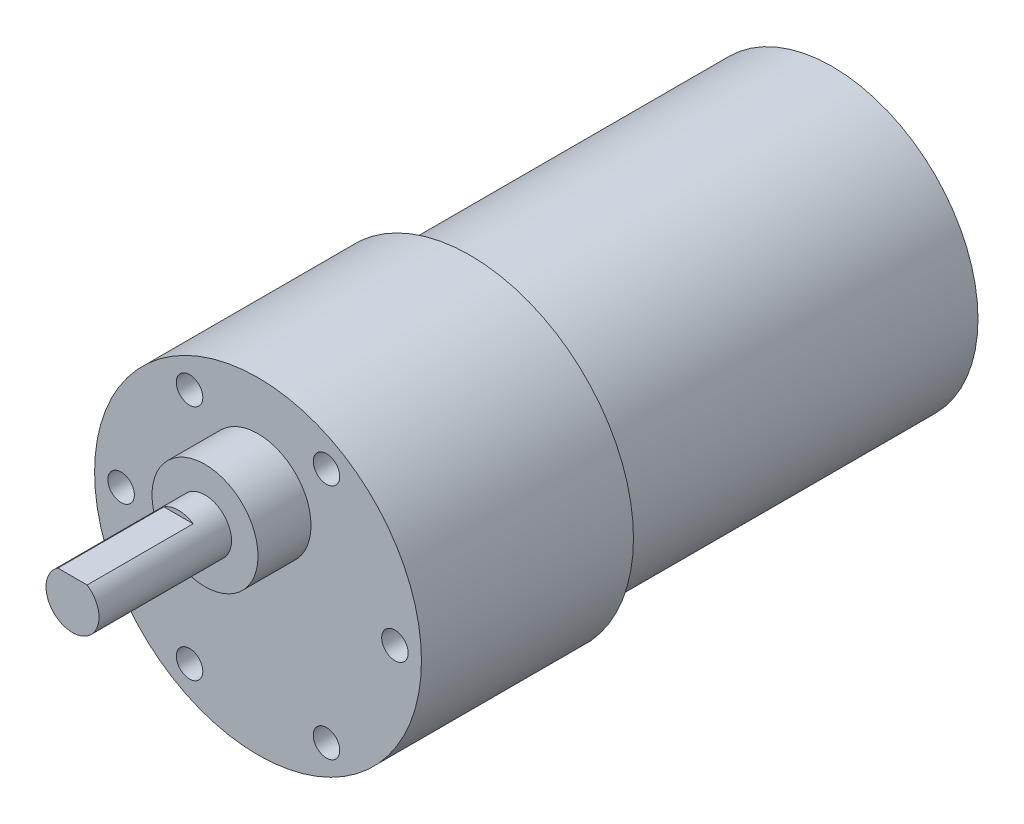
ISO-10303-21;
HEADER;
FILE_DESCRIPTION(('STEP AP214'),'2;1');
FILE_NAME('part.step','',(''),(''),'','','');
FILE_SCHEMA(('AUTOMOTIVE_DESIGN { 1 0 10303 214 1 1 1 1 }'));
ENDSEC;
DATA;
#1=APPLICATION_CONTEXT('core data for automotive mechanical design processes');
#2=APPLICATION_PROTOCOL_DEFINITION('international standard','automotive_design',2000,#1);
#3=PRODUCT_CONTEXT('',#1,'mechanical');
#4=PRODUCT('Part','Part','',(#3));
#5=PRODUCT_RELATED_PRODUCT_CATEGORY('part','',(#4));
#6=PRODUCT_DEFINITION_FORMATION('','',#4);
#7=PRODUCT_DEFINITION_CONTEXT('part definition',#1,'design');
#8=PRODUCT_DEFINITION('design','',#6,#7);
#9=PRODUCT_DEFINITION_SHAPE('','',#8);
#10=(LENGTH_UNIT() NAMED_UNIT(*) SI_UNIT(.MILLI.,.METRE.));
#11=(NAMED_UNIT(*) PLANE_ANGLE_UNIT() SI_UNIT($,.RADIAN.));
#12=(NAMED_UNIT(*) SI_UNIT($,.STERADIAN.) SOLID_ANGLE_UNIT());
#13=UNCERTAINTY_MEASURE_WITH_UNIT(LENGTH_MEASURE(1.E-05),#10,'distance_accuracy_value','');
#14=(GEOMETRIC_REPRESENTATION_CONTEXT(3) GLOBAL_UNCERTAINTY_ASSIGNED_CONTEXT((#13)) GLOBAL_UNIT_ASSIGNED_CONTEXT((#10,
#11,#12)) REPRESENTATION_CONTEXT('',''));
#15=CARTESIAN_POINT('',(0.,0.,0.));
#16=DIRECTION('',(0.,0.,1.));
#17=DIRECTION('',(1.,0.,0.));
#18=AXIS2_PLACEMENT_3D('',#15,#16,#17);
#19=CARTESIAN_POINT('',(0.,0.,29.));
#20=DIRECTION('',(0.,0.,-1.));
#21=DIRECTION('',(-1.,0.,0.));
#22=AXIS2_PLACEMENT_3D('',#19,#20,#21);
#23=CYLINDRICAL_SURFACE('',#22,16.5);
#24=CARTESIAN_POINT('',(0.,0.,29.));
#25=DIRECTION('',(0.,0.,1.));
#26=DIRECTION('',(1.,0.,0.));
#27=AXIS2_PLACEMENT_3D('',#24,#25,#26);
#28=CIRCLE('',#27,16.5);
#29=CARTESIAN_POINT('',(-16.5,0.,29.));
#30=VERTEX_POINT('',#29);
#31=EDGE_CURVE('E42',#30,#30,#28,.T.);
#32=CARTESIAN_POINT('',(0.,0.,-12.));
#33=DIRECTION('',(0.,0.,-1.));
#34=DIRECTION('',(-1.,0.,0.));
#35=AXIS2_PLACEMENT_3D('',#32,#33,#34);
#36=CIRCLE('',#35,16.5);
#37=CARTESIAN_POINT('',(-16.5,0.,-12.));
#38=VERTEX_POINT('',#37);
#39=EDGE_CURVE('E79',#38,#38,#36,.T.);
#40=CARTESIAN_POINT('',(-16.5,0.,29.));
#41=CARTESIAN_POINT('',(-16.5,0.,28.5729166666667));
#42=CARTESIAN_POINT('',(-16.5,0.,28.1458333333333));
#43=CARTESIAN_POINT('',(-16.5,0.,27.2916666666667));
#44=CARTESIAN_POINT('',(-16.5,0.,26.8645833333333));
#45=CARTESIAN_POINT('',(-16.5,0.,26.0104166666667));
#46=CARTESIAN_POINT('',(-16.5,0.,25.5833333333333));
#47=CARTESIAN_POINT('',(-16.5,0.,24.7291666666667));
#48=CARTESIAN_POINT('',(-16.5,0.,24.3020833333333));
#49=CARTESIAN_POINT('',(-16.5,0.,23.4479166666667));
#50=CARTESIAN_POINT('',(-16.5,0.,23.0208333333333));
#51=CARTESIAN_POINT('',(-16.5,0.,22.1666666666667));
#52=CARTESIAN_POINT('',(-16.5,0.,21.7395833333333));
#53=CARTESIAN_POINT('',(-16.5,0.,20.8854166666667));
#54=CARTESIAN_POINT('',(-16.5,0.,20.4583333333333));
#55=CARTESIAN_POINT('',(-16.5,0.,19.6041666666667));
#56=CARTESIAN_POINT('',(-16.5,0.,19.1770833333333));
#57=CARTESIAN_POINT('',(-16.5,0.,18.3229166666667));
#58=CARTESIAN_POINT('',(-16.5,0.,17.8958333333333));
#59=CARTESIAN_POINT('',(-16.5,0.,17.0416666666667));
#60=CARTESIAN_POINT('',(-16.5,0.,16.6145833333333));
#61=CARTESIAN_POINT('',(-16.5,0.,15.7604166666667));
#62=CARTESIAN_POINT('',(-16.5,0.,15.3333333333333));
#63=CARTESIAN_POINT('',(-16.5,0.,14.4791666666667));
#64=CARTESIAN_POINT('',(-16.5,0.,14.0520833333333));
#65=CARTESIAN_POINT('',(-16.5,0.,13.1979166666667));
#66=CARTESIAN_POINT('',(-16.5,0.,12.7708333333333));
#67=CARTESIAN_POINT('',(-16.5,0.,11.9166666666667));
#68=CARTESIAN_POINT('',(-16.5,0.,11.4895833333333));
#69=CARTESIAN_POINT('',(-16.5,0.,10.6354166666667));
#70=CARTESIAN_POINT('',(-16.5,0.,10.2083333333333));
#71=CARTESIAN_POINT('',(-16.5,0.,9.35416666666666));
#72=CARTESIAN_POINT('',(-16.5,0.,8.92708333333333));
#73=CARTESIAN_POINT('',(-16.5,0.,8.07291666666666));
#74=CARTESIAN_POINT('',(-16.5,0.,7.64583333333333));
#75=CARTESIAN_POINT('',(-16.5,0.,6.79166666666666));
#76=CARTESIAN_POINT('',(-16.5,0.,6.36458333333333));
#77=CARTESIAN_POINT('',(-16.5,0.,5.51041666666666));
#78=CARTESIAN_POINT('',(-16.5,0.,5.08333333333333));
#79=CARTESIAN_POINT('',(-16.5,0.,4.22916666666666));
#80=CARTESIAN_POINT('',(-16.5,0.,3.80208333333333));
#81=CARTESIAN_POINT('',(-16.5,0.,2.94791666666666));
#82=CARTESIAN_POINT('',(-16.5,0.,2.52083333333333));
#83=CARTESIAN_POINT('',(-16.5,0.,1.66666666666666));
#84=CARTESIAN_POINT('',(-16.5,0.,1.23958333333333));
#85=CARTESIAN_POINT('',(-16.5,0.,0.385416666666664));
#86=CARTESIAN_POINT('',(-16.5,0.,-0.0416666666666702));
#87=CARTESIAN_POINT('',(-16.5,0.,-0.895833333333338));
#88=CARTESIAN_POINT('',(-16.5,0.,-1.32291666666667));
#89=CARTESIAN_POINT('',(-16.5,0.,-2.17708333333334));
#90=CARTESIAN_POINT('',(-16.5,0.,-2.60416666666667));
#91=CARTESIAN_POINT('',(-16.5,0.,-3.45833333333333));
#92=CARTESIAN_POINT('',(-16.5,0.,-3.88541666666667));
#93=CARTESIAN_POINT('',(-16.5,0.,-4.73958333333333));
#94=CARTESIAN_POINT('',(-16.5,0.,-5.16666666666667));
#95=CARTESIAN_POINT('',(-16.5,0.,-6.02083333333333));
#96=CARTESIAN_POINT('',(-16.5,0.,-6.44791666666666));
#97=CARTESIAN_POINT('',(-16.5,0.,-7.30208333333333));
#98=CARTESIAN_POINT('',(-16.5,0.,-7.72916666666667));
#99=CARTESIAN_POINT('',(-16.5,0.,-8.58333333333333));
#100=CARTESIAN_POINT('',(-16.5,0.,-9.01041666666666));
#101=CARTESIAN_POINT('',(-16.5,0.,-9.86458333333333));
#102=CARTESIAN_POINT('',(-16.5,0.,-10.2916666666667));
#103=CARTESIAN_POINT('',(-16.5,0.,-11.1458333333333));
#104=CARTESIAN_POINT('',(-16.5,0.,-11.5729166666667));
#105=CARTESIAN_POINT('',(-16.5,0.,-12.));
#106=B_SPLINE_CURVE_WITH_KNOTS('',3,(#40,#41,#42,#43,#44,#45,#46,#47,#48,#49,#50,#51,#52,#53,
#54,#55,#56,#57,#58,#59,#60,#61,#62,#63,#64,#65,#66,#67,#68,#69,#70,#71,#72,#73,#74,#75,#76,#77,
#78,#79,#80,#81,#82,#83,#84,#85,#86,#87,#88,#89,#90,#91,#92,#93,#94,#95,#96,#97,#98,#99,#100,
#101,#102,#103,#104,#105),.UNSPECIFIED.,.F.,.F.,(4,2,2,2,2,2,2,2,2,2,2,2,2,2,2,2,2,2,2,2,2,2,2,
2,2,2,2,2,2,2,2,2,4),(0.,1.28125,2.5625,3.84375,5.125,6.40625,7.6875,8.96875,10.25,11.53125,
12.8125,14.09375,15.375,16.65625,17.9375,19.21875,20.5,21.78125,23.0625,24.34375,25.625,
26.90625,28.1875,29.46875,30.75,32.03125,33.3125,34.59375,35.875,37.15625,38.4375,39.71875,41.),.UNSPECIFIED.);
#107=EDGE_CURVE('BSEAM39',#30,#38,#106,.T.);
#108=ORIENTED_EDGE('',*,*,#31,.F.);
#109=ORIENTED_EDGE('',*,*,#39,.F.);
#110=ORIENTED_EDGE('',*,*,#107,.T.);
#111=ORIENTED_EDGE('',*,*,#107,.F.);
#112=EDGE_LOOP('',(#108,#110,#109,#111));
#113=FACE_BOUND('',#112,.T.);
#114=ADVANCED_FACE('F39',(#113),#23,.T.);
#115=CARTESIAN_POINT('',(0.,0.,53.));
#116=DIRECTION('',(0.,0.,-1.));
#117=DIRECTION('',(-1.,0.,0.));
#118=AXIS2_PLACEMENT_3D('',#115,#116,#117);
#119=CYLINDRICAL_SURFACE('',#118,18.5);
#120=CARTESIAN_POINT('',(0.,0.,53.));
#121=DIRECTION('',(0.,0.,1.));
#122=DIRECTION('',(1.,0.,0.));
#123=AXIS2_PLACEMENT_3D('',#120,#121,#122);
#124=CIRCLE('',#123,18.5);
#125=CARTESIAN_POINT('',(18.5,0.,53.));
#126=VERTEX_POINT('',#125);
#127=EDGE_CURVE('E93',#126,#126,#124,.T.);
#128=ORIENTED_EDGE('',*,*,#127,.F.);
#129=EDGE_LOOP('',(#128));
#130=FACE_BOUND('',#129,.T.);
#131=CARTESIAN_POINT('',(0.,0.,29.));
#132=DIRECTION('',(0.,0.,1.));
#133=DIRECTION('',(1.,0.,0.));
#134=AXIS2_PLACEMENT_3D('',#131,#132,#133);
#135=CIRCLE('',#134,18.5);
#136=CARTESIAN_POINT('',(18.5,0.,29.));
#137=VERTEX_POINT('',#136);
#138=EDGE_CURVE('E90',#137,#137,#135,.T.);
#139=ORIENTED_EDGE('',*,*,#138,.T.);
#140=EDGE_LOOP('',(#139));
#141=FACE_BOUND('',#140,.T.);
#142=ADVANCED_FACE('F98',(#130,#141),#119,.T.);
#143=CARTESIAN_POINT('',(0.,0.,53.));
#144=DIRECTION('',(0.,0.,1.));
#145=DIRECTION('',(1.,0.,0.));
#146=AXIS2_PLACEMENT_3D('',#143,#144,#145);
#147=PLANE('',#146);
#148=CARTESIAN_POINT('',(-15.5,0.,53.));
#149=DIRECTION('',(0.,0.,1.));
#150=DIRECTION('',(1.,0.,0.));
#151=AXIS2_PLACEMENT_3D('',#148,#149,#150);
#152=CIRCLE('',#151,1.5);
#153=CARTESIAN_POINT('',(-14.,0.,53.));
#154=VERTEX_POINT('',#153);
#155=EDGE_CURVE('E131',#154,#154,#152,.T.);
#156=ORIENTED_EDGE('',*,*,#155,.F.);
#157=EDGE_LOOP('',(#156));
#158=FACE_BOUND('',#157,.T.);
#159=CARTESIAN_POINT('',(-7.74999999999987,13.4233937586589,53.));
#160=DIRECTION('',(0.,0.,1.));
#161=DIRECTION('',(1.,0.,0.));
#162=AXIS2_PLACEMENT_3D('',#159,#160,#161);
#163=CIRCLE('',#162,1.5);
#164=CARTESIAN_POINT('',(-6.24999999999987,13.4233937586589,53.));
#165=VERTEX_POINT('',#164);
#166=EDGE_CURVE('E409',#165,#165,#163,.T.);
#167=ORIENTED_EDGE('',*,*,#166,.F.);
#168=EDGE_LOOP('',(#167));
#169=FACE_BOUND('',#168,.T.);
#170=CARTESIAN_POINT('',(-7.75000000000006,-13.4233937586588,53.));
#171=DIRECTION('',(0.,0.,1.));
#172=DIRECTION('',(1.,0.,0.));
#173=AXIS2_PLACEMENT_3D('',#170,#171,#172);
#174=CIRCLE('',#173,1.5);
#175=CARTESIAN_POINT('',(-6.25000000000006,-13.4233937586588,53.));
#176=VERTEX_POINT('',#175);
#177=EDGE_CURVE('E428',#176,#176,#174,.T.);
#178=ORIENTED_EDGE('',*,*,#177,.F.);
#179=EDGE_LOOP('',(#178));
#180=FACE_BOUND('',#179,.T.);
#181=CARTESIAN_POINT('',(7.74999999999987,-13.4233937586589,53.));
#182=DIRECTION('',(0.,0.,1.));
#183=DIRECTION('',(1.,0.,0.));
#184=AXIS2_PLACEMENT_3D('',#181,#182,#183);
#185=CIRCLE('',#184,1.5);
#186=CARTESIAN_POINT('',(9.24999999999988,-13.4233937586589,53.));
#187=VERTEX_POINT('',#186);
#188=EDGE_CURVE('E423',#187,#187,#185,.T.);
#189=ORIENTED_EDGE('',*,*,#188,.F.);
#190=EDGE_LOOP('',(#189));
#191=FACE_BOUND('',#190,.T.);
#192=CARTESIAN_POINT('',(7.75000000000006,13.4233937586588,53.));
#193=DIRECTION('',(0.,0.,1.));
#194=DIRECTION('',(1.,0.,0.));
#195=AXIS2_PLACEMENT_3D('',#192,#193,#194);
#196=CIRCLE('',#195,1.5);
#197=CARTESIAN_POINT('',(9.25000000000006,13.4233937586588,53.));
#198=VERTEX_POINT('',#197);
#199=EDGE_CURVE('E417',#198,#198,#196,.T.);
#200=ORIENTED_EDGE('',*,*,#199,.F.);
#201=EDGE_LOOP('',(#200));
#202=FACE_BOUND('',#201,.T.);
#203=CARTESIAN_POINT('',(15.5,0.,53.));
#204=DIRECTION('',(0.,0.,1.));
#205=DIRECTION('',(1.,0.,0.));
#206=AXIS2_PLACEMENT_3D('',#203,#204,#205);
#207=CIRCLE('',#206,1.5);
#208=CARTESIAN_POINT('',(17.,0.,53.));
#209=VERTEX_POINT('',#208);
#210=EDGE_CURVE('E403',#209,#209,#207,.T.);
#211=ORIENTED_EDGE('',*,*,#210,.F.);
#212=EDGE_LOOP('',(#211));
#213=FACE_BOUND('',#212,.T.);
#214=CARTESIAN_POINT('',(0.,7.,53.));
#215=DIRECTION('',(0.,0.,1.));
#216=DIRECTION('',(1.,0.,0.));
#217=AXIS2_PLACEMENT_3D('',#214,#215,#216);
#218=CIRCLE('',#217,6.);
#219=CARTESIAN_POINT('',(6.,7.,53.));
#220=VERTEX_POINT('',#219);
#221=EDGE_CURVE('E71',#220,#220,#218,.T.);
#222=ORIENTED_EDGE('',*,*,#221,.F.);
#223=EDGE_LOOP('',(#222));
#224=FACE_BOUND('',#223,.T.);
#225=ORIENTED_EDGE('',*,*,#127,.T.);
#226=EDGE_LOOP('',(#225));
#227=FACE_BOUND('',#226,.T.);
#228=ADVANCED_FACE('F103',(#158,#169,#180,#191,#202,#213,#224,#227),#147,.T.);
#229=CARTESIAN_POINT('',(0.,0.,29.));
#230=DIRECTION('',(0.,0.,1.));
#231=DIRECTION('',(1.,0.,0.));
#232=AXIS2_PLACEMENT_3D('',#229,#230,#231);
#233=PLANE('',#232);
#234=ORIENTED_EDGE('',*,*,#31,.T.);
#235=EDGE_LOOP('',(#234));
#236=FACE_BOUND('',#235,.T.);
#237=ORIENTED_EDGE('',*,*,#138,.F.);
#238=EDGE_LOOP('',(#237));
#239=FACE_BOUND('',#238,.T.);
#240=ADVANCED_FACE('F100',(#236,#239),#233,.F.);
#241=CARTESIAN_POINT('',(0.,7.,59.));
#242=DIRECTION('',(0.,0.,-1.));
#243=DIRECTION('',(-1.,0.,0.));
#244=AXIS2_PLACEMENT_3D('',#241,#242,#243);
#245=CYLINDRICAL_SURFACE('',#244,6.);
#246=CARTESIAN_POINT('',(0.,7.,59.));
#247=DIRECTION('',(0.,0.,1.));
#248=DIRECTION('',(1.,0.,0.));
#249=AXIS2_PLACEMENT_3D('',#246,#247,#248);
#250=CIRCLE('',#249,6.);
#251=CARTESIAN_POINT('',(6.,7.,59.));
#252=VERTEX_POINT('',#251);
#253=EDGE_CURVE('E87',#252,#252,#250,.T.);
#254=ORIENTED_EDGE('',*,*,#253,.F.);
#255=EDGE_LOOP('',(#254));
#256=FACE_BOUND('',#255,.T.);
#257=ORIENTED_EDGE('',*,*,#221,.T.);
#258=EDGE_LOOP('',(#257));
#259=FACE_BOUND('',#258,.T.);
#260=ADVANCED_FACE('F102',(#256,#259),#245,.T.);
#261=CARTESIAN_POINT('',(0.,7.,59.));
#262=DIRECTION('',(0.,0.,1.));
#263=DIRECTION('',(1.,0.,0.));
#264=AXIS2_PLACEMENT_3D('',#261,#262,#263);
#265=PLANE('',#264);
#266=CARTESIAN_POINT('',(0.,7.,59.));
#267=DIRECTION('',(0.,0.,1.));
#268=DIRECTION('',(1.,0.,0.));
#269=AXIS2_PLACEMENT_3D('',#266,#267,#268);
#270=CIRCLE('',#269,3.);
#271=CARTESIAN_POINT('',(3.,7.,59.));
#272=VERTEX_POINT('',#271);
#273=EDGE_CURVE('E11',#272,#272,#270,.T.);
#274=ORIENTED_EDGE('',*,*,#273,.F.);
#275=EDGE_LOOP('',(#274));
#276=FACE_BOUND('',#275,.T.);
#277=ORIENTED_EDGE('',*,*,#253,.T.);
#278=EDGE_LOOP('',(#277));
#279=FACE_BOUND('',#278,.T.);
#280=ADVANCED_FACE('F110',(#276,#279),#265,.T.);
#281=CARTESIAN_POINT('',(0.,7.,62.));
#282=DIRECTION('',(0.,0.,-1.));
#283=DIRECTION('',(-1.,0.,0.));
#284=AXIS2_PLACEMENT_3D('',#281,#282,#283);
#285=CYLINDRICAL_SURFACE('',#284,3.);
#286=CARTESIAN_POINT('',(0.,7.,62.));
#287=DIRECTION('',(0.,0.,1.));
#288=DIRECTION('',(1.,0.,0.));
#289=AXIS2_PLACEMENT_3D('',#286,#287,#288);
#290=CIRCLE('',#289,3.);
#291=CARTESIAN_POINT('',(1.6583123951777,9.5,62.));
#292=VERTEX_POINT('',#291);
#293=CARTESIAN_POINT('',(-1.6583123951777,9.5,62.));
#294=VERTEX_POINT('',#293);
#295=EDGE_CURVE('E65',#292,#294,#290,.T.);
#296=ORIENTED_EDGE('',*,*,#295,.F.);
#297=DIRECTION('',(0.,0.,-1.));
#298=VECTOR('',#297,1.);
#299=CARTESIAN_POINT('',(1.6583123951777,9.5,74.));
#300=LINE('',#299,#298);
#301=CARTESIAN_POINT('',(1.6583123951777,9.5,74.));
#302=VERTEX_POINT('',#301);
#303=EDGE_CURVE('E72',#302,#292,#300,.T.);
#304=ORIENTED_EDGE('',*,*,#303,.F.);
#305=CARTESIAN_POINT('',(0.,7.,74.));
#306=DIRECTION('',(0.,0.,1.));
#307=DIRECTION('',(1.,0.,0.));
#308=AXIS2_PLACEMENT_3D('',#305,#306,#307);
#309=CIRCLE('',#308,3.);
#310=CARTESIAN_POINT('',(-1.6583123951777,9.5,74.));
#311=VERTEX_POINT('',#310);
#312=EDGE_CURVE('E78',#311,#302,#309,.T.);
#313=ORIENTED_EDGE('',*,*,#312,.F.);
#314=DIRECTION('',(0.,0.,-1.));
#315=VECTOR('',#314,1.);
#316=CARTESIAN_POINT('',(-1.6583123951777,9.5,74.));
#317=LINE('',#316,#315);
#318=EDGE_CURVE('E76',#311,#294,#317,.T.);
#319=ORIENTED_EDGE('',*,*,#318,.T.);
#320=EDGE_LOOP('',(#296,#304,#313,#319));
#321=FACE_BOUND('',#320,.T.);
#322=ORIENTED_EDGE('',*,*,#273,.T.);
#323=EDGE_LOOP('',(#322));
#324=FACE_BOUND('',#323,.T.);
#325=ADVANCED_FACE('F81',(#321,#324),#285,.T.);
#326=CARTESIAN_POINT('',(0.,7.,62.));
#327=DIRECTION('',(0.,0.,1.));
#328=DIRECTION('',(1.,0.,0.));
#329=AXIS2_PLACEMENT_3D('',#326,#327,#328);
#330=PLANE('',#329);
#331=DIRECTION('',(-1.,0.,0.));
#332=VECTOR('',#331,1.);
#333=CARTESIAN_POINT('',(-1.6583123951777,9.5,62.));
#334=LINE('',#333,#332);
#335=EDGE_CURVE('E53',#292,#294,#334,.T.);
#336=ORIENTED_EDGE('',*,*,#335,.F.);
#337=ORIENTED_EDGE('',*,*,#295,.T.);
#338=EDGE_LOOP('',(#336,#337));
#339=FACE_BOUND('',#338,.T.);
#340=ADVANCED_FACE('F66',(#339),#330,.T.);
#341=CARTESIAN_POINT('',(-1.6583123951777,9.5,74.));
#342=DIRECTION('',(0.,-1.,0.));
#343=DIRECTION('',(0.,0.,-1.));
#344=AXIS2_PLACEMENT_3D('',#341,#342,#343);
#345=PLANE('',#344);
#346=ORIENTED_EDGE('',*,*,#335,.T.);
#347=ORIENTED_EDGE('',*,*,#318,.F.);
#348=DIRECTION('',(-1.,0.,0.));
#349=VECTOR('',#348,1.);
#350=CARTESIAN_POINT('',(-1.6583123951777,9.5,74.));
#351=LINE('',#350,#349);
#352=EDGE_CURVE('E61',#302,#311,#351,.T.);
#353=ORIENTED_EDGE('',*,*,#352,.F.);
#354=ORIENTED_EDGE('',*,*,#303,.T.);
#355=EDGE_LOOP('',(#346,#347,#353,#354));
#356=FACE_BOUND('',#355,.T.);
#357=ADVANCED_FACE('F75',(#356),#345,.F.);
#358=CARTESIAN_POINT('',(0.,7.,74.));
#359=DIRECTION('',(0.,0.,1.));
#360=DIRECTION('',(1.,0.,0.));
#361=AXIS2_PLACEMENT_3D('',#358,#359,#360);
#362=PLANE('',#361);
#363=ORIENTED_EDGE('',*,*,#312,.T.);
#364=ORIENTED_EDGE('',*,*,#352,.T.);
#365=EDGE_LOOP('',(#363,#364));
#366=FACE_BOUND('',#365,.T.);
#367=ADVANCED_FACE('F137',(#366),#362,.T.);
#368=CARTESIAN_POINT('',(0.,0.,-12.));
#369=DIRECTION('',(0.,0.,-1.));
#370=DIRECTION('',(-1.,0.,0.));
#371=AXIS2_PLACEMENT_3D('',#368,#369,#370);
#372=PLANE('',#371);
#373=ORIENTED_EDGE('',*,*,#39,.T.);
#374=EDGE_LOOP('',(#373));
#375=FACE_BOUND('',#374,.T.);
#376=ADVANCED_FACE('F139',(#375),#372,.T.);
#377=CARTESIAN_POINT('',(15.5,0.,48.));
#378=DIRECTION('',(0.,0.,1.));
#379=DIRECTION('',(1.,0.,0.));
#380=AXIS2_PLACEMENT_3D('',#377,#378,#379);
#381=CYLINDRICAL_SURFACE('',#380,1.5);
#382=CARTESIAN_POINT('',(15.5,0.,48.));
#383=DIRECTION('',(0.,0.,1.));
#384=DIRECTION('',(1.,0.,0.));
#385=AXIS2_PLACEMENT_3D('',#382,#383,#384);
#386=CIRCLE('',#385,1.5);
#387=CARTESIAN_POINT('',(17.,0.,48.));
#388=VERTEX_POINT('',#387);
#389=EDGE_CURVE('E406',#388,#388,#386,.T.);
#390=ORIENTED_EDGE('',*,*,#389,.F.);
#391=EDGE_LOOP('',(#390));
#392=FACE_BOUND('',#391,.T.);
#393=ORIENTED_EDGE('',*,*,#210,.T.);
#394=EDGE_LOOP('',(#393));
#395=FACE_BOUND('',#394,.T.);
#396=ADVANCED_FACE('F145',(#392,#395),#381,.F.);
#397=CARTESIAN_POINT('',(15.5,0.,48.));
#398=DIRECTION('',(0.,0.,1.));
#399=DIRECTION('',(1.,0.,0.));
#400=AXIS2_PLACEMENT_3D('',#397,#398,#399);
#401=PLANE('',#400);
#402=ORIENTED_EDGE('',*,*,#389,.T.);
#403=EDGE_LOOP('',(#402));
#404=FACE_BOUND('',#403,.T.);
#405=ADVANCED_FACE('F215',(#404),#401,.T.);
#406=CARTESIAN_POINT('',(7.75000000000006,13.4233937586588,48.));
#407=DIRECTION('',(0.,0.,1.));
#408=DIRECTION('',(1.,0.,0.));
#409=AXIS2_PLACEMENT_3D('',#406,#407,#408);
#410=CYLINDRICAL_SURFACE('',#409,1.5);
#411=CARTESIAN_POINT('',(7.75000000000006,13.4233937586588,48.));
#412=DIRECTION('',(0.,0.,1.));
#413=DIRECTION('',(1.,0.,0.));
#414=AXIS2_PLACEMENT_3D('',#411,#412,#413);
#415=CIRCLE('',#414,1.5);
#416=CARTESIAN_POINT('',(9.25000000000006,13.4233937586588,48.));
#417=VERTEX_POINT('',#416);
#418=EDGE_CURVE('E420',#417,#417,#415,.T.);
#419=ORIENTED_EDGE('',*,*,#418,.F.);
#420=EDGE_LOOP('',(#419));
#421=FACE_BOUND('',#420,.T.);
#422=ORIENTED_EDGE('',*,*,#199,.T.);
#423=EDGE_LOOP('',(#422));
#424=FACE_BOUND('',#423,.T.);
#425=ADVANCED_FACE('F226',(#421,#424),#410,.F.);
#426=CARTESIAN_POINT('',(7.75000000000006,13.4233937586588,48.));
#427=DIRECTION('',(0.,0.,1.));
#428=DIRECTION('',(1.,0.,0.));
#429=AXIS2_PLACEMENT_3D('',#426,#427,#428);
#430=PLANE('',#429);
#431=ORIENTED_EDGE('',*,*,#418,.T.);
#432=EDGE_LOOP('',(#431));
#433=FACE_BOUND('',#432,.T.);
#434=ADVANCED_FACE('F237',(#433),#430,.T.);
#435=CARTESIAN_POINT('',(7.74999999999987,-13.4233937586589,48.));
#436=DIRECTION('',(0.,0.,1.));
#437=DIRECTION('',(1.,0.,0.));
#438=AXIS2_PLACEMENT_3D('',#435,#436,#437);
#439=CYLINDRICAL_SURFACE('',#438,1.5);
#440=CARTESIAN_POINT('',(7.74999999999987,-13.4233937586589,48.));
#441=DIRECTION('',(0.,0.,1.));
#442=DIRECTION('',(1.,0.,0.));
#443=AXIS2_PLACEMENT_3D('',#440,#441,#442);
#444=CIRCLE('',#443,1.5);
#445=CARTESIAN_POINT('',(9.24999999999988,-13.4233937586589,48.));
#446=VERTEX_POINT('',#445);
#447=EDGE_CURVE('E426',#446,#446,#444,.T.);
#448=ORIENTED_EDGE('',*,*,#447,.F.);
#449=EDGE_LOOP('',(#448));
#450=FACE_BOUND('',#449,.T.);
#451=ORIENTED_EDGE('',*,*,#188,.T.);
#452=EDGE_LOOP('',(#451));
#453=FACE_BOUND('',#452,.T.);
#454=ADVANCED_FACE('F248',(#450,#453),#439,.F.);
#455=CARTESIAN_POINT('',(7.74999999999987,-13.4233937586589,48.));
#456=DIRECTION('',(0.,0.,1.));
#457=DIRECTION('',(1.,0.,0.));
#458=AXIS2_PLACEMENT_3D('',#455,#456,#457);
#459=PLANE('',#458);
#460=ORIENTED_EDGE('',*,*,#447,.T.);
#461=EDGE_LOOP('',(#460));
#462=FACE_BOUND('',#461,.T.);
#463=ADVANCED_FACE('F259',(#462),#459,.T.);
#464=CARTESIAN_POINT('',(-7.75000000000006,-13.4233937586588,48.));
#465=DIRECTION('',(0.,0.,1.));
#466=DIRECTION('',(1.,0.,0.));
#467=AXIS2_PLACEMENT_3D('',#464,#465,#466);
#468=CYLINDRICAL_SURFACE('',#467,1.5);
#469=CARTESIAN_POINT('',(-7.75000000000006,-13.4233937586588,48.));
#470=DIRECTION('',(0.,0.,1.));
#471=DIRECTION('',(1.,0.,0.));
#472=AXIS2_PLACEMENT_3D('',#469,#470,#471);
#473=CIRCLE('',#472,1.5);
#474=CARTESIAN_POINT('',(-6.25000000000006,-13.4233937586588,48.));
#475=VERTEX_POINT('',#474);
#476=EDGE_CURVE('E135',#475,#475,#473,.T.);
#477=ORIENTED_EDGE('',*,*,#476,.F.);
#478=EDGE_LOOP('',(#477));
#479=FACE_BOUND('',#478,.T.);
#480=ORIENTED_EDGE('',*,*,#177,.T.);
#481=EDGE_LOOP('',(#480));
#482=FACE_BOUND('',#481,.T.);
#483=ADVANCED_FACE('F270',(#479,#482),#468,.F.);
#484=CARTESIAN_POINT('',(-7.75000000000006,-13.4233937586588,48.));
#485=DIRECTION('',(0.,0.,1.));
#486=DIRECTION('',(1.,0.,0.));
#487=AXIS2_PLACEMENT_3D('',#484,#485,#486);
#488=PLANE('',#487);
#489=ORIENTED_EDGE('',*,*,#476,.T.);
#490=EDGE_LOOP('',(#489));
#491=FACE_BOUND('',#490,.T.);
#492=ADVANCED_FACE('F281',(#491),#488,.T.);
#493=CARTESIAN_POINT('',(-7.74999999999987,13.4233937586589,48.));
#494=DIRECTION('',(0.,0.,1.));
#495=DIRECTION('',(1.,0.,0.));
#496=AXIS2_PLACEMENT_3D('',#493,#494,#495);
#497=CYLINDRICAL_SURFACE('',#496,1.5);
#498=CARTESIAN_POINT('',(-7.74999999999987,13.4233937586589,48.));
#499=DIRECTION('',(0.,0.,1.));
#500=DIRECTION('',(1.,0.,0.));
#501=AXIS2_PLACEMENT_3D('',#498,#499,#500);
#502=CIRCLE('',#501,1.5);
#503=CARTESIAN_POINT('',(-6.24999999999987,13.4233937586589,48.));
#504=VERTEX_POINT('',#503);
#505=EDGE_CURVE('E412',#504,#504,#502,.T.);
#506=ORIENTED_EDGE('',*,*,#505,.F.);
#507=EDGE_LOOP('',(#506));
#508=FACE_BOUND('',#507,.T.);
#509=ORIENTED_EDGE('',*,*,#166,.T.);
#510=EDGE_LOOP('',(#509));
#511=FACE_BOUND('',#510,.T.);
#512=ADVANCED_FACE('F292',(#508,#511),#497,.F.);
#513=CARTESIAN_POINT('',(-7.74999999999987,13.4233937586589,48.));
#514=DIRECTION('',(0.,0.,1.));
#515=DIRECTION('',(1.,0.,0.));
#516=AXIS2_PLACEMENT_3D('',#513,#514,#515);
#517=PLANE('',#516);
#518=ORIENTED_EDGE('',*,*,#505,.T.);
#519=EDGE_LOOP('',(#518));
#520=FACE_BOUND('',#519,.T.);
#521=ADVANCED_FACE('F302',(#520),#517,.T.);
#522=CARTESIAN_POINT('',(-15.5,0.,48.));
#523=DIRECTION('',(0.,0.,1.));
#524=DIRECTION('',(1.,0.,0.));
#525=AXIS2_PLACEMENT_3D('',#522,#523,#524);
#526=CYLINDRICAL_SURFACE('',#525,1.5);
#527=CARTESIAN_POINT('',(-15.5,0.,48.));
#528=DIRECTION('',(0.,0.,1.));
#529=DIRECTION('',(1.,0.,0.));
#530=AXIS2_PLACEMENT_3D('',#527,#528,#529);
#531=CIRCLE('',#530,1.5);
#532=CARTESIAN_POINT('',(-14.,0.,48.));
#533=VERTEX_POINT('',#532);
#534=EDGE_CURVE('E128',#533,#533,#531,.T.);
#535=ORIENTED_EDGE('',*,*,#534,.F.);
#536=EDGE_LOOP('',(#535));
#537=FACE_BOUND('',#536,.T.);
#538=ORIENTED_EDGE('',*,*,#155,.T.);
#539=EDGE_LOOP('',(#538));
#540=FACE_BOUND('',#539,.T.);
#541=ADVANCED_FACE('F313',(#537,#540),#526,.F.);
#542=CARTESIAN_POINT('',(-15.5,0.,48.));
#543=DIRECTION('',(0.,0.,1.));
#544=DIRECTION('',(1.,0.,0.));
#545=AXIS2_PLACEMENT_3D('',#542,#543,#544);
#546=PLANE('',#545);
#547=ORIENTED_EDGE('',*,*,#534,.T.);
#548=EDGE_LOOP('',(#547));
#549=FACE_BOUND('',#548,.T.);
#550=ADVANCED_FACE('F324',(#549),#546,.T.);
#551=CLOSED_SHELL('',(#114,#142,#228,#240,#260,#280,#325,#340,#357,#367,#376,#396,#405,#425,
#434,#454,#463,#483,#492,#512,#521,#541,#550));
#552=MANIFOLD_SOLID_BREP('B2',#551);
#553=ADVANCED_BREP_SHAPE_REPRESENTATION('',(#18,#552),#14);
#554=SHAPE_DEFINITION_REPRESENTATION(#9,#553);
ENDSEC;
END-ISO-10303-21;
